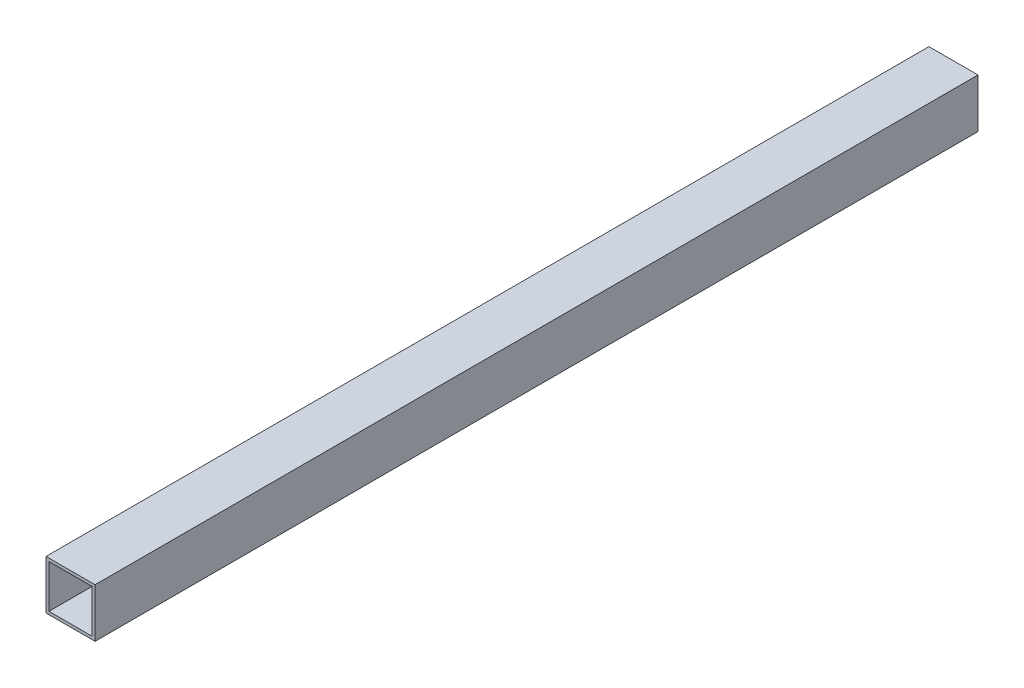
ISO-10303-21;
HEADER;
FILE_DESCRIPTION(('STEP AP214'),'2;1');
FILE_NAME('part.step','',(''),(''),'','','');
FILE_SCHEMA(('AUTOMOTIVE_DESIGN { 1 0 10303 214 1 1 1 1 }'));
ENDSEC;
DATA;
#1=APPLICATION_CONTEXT('core data for automotive mechanical design processes');
#2=APPLICATION_PROTOCOL_DEFINITION('international standard','automotive_design',2000,#1);
#3=PRODUCT_CONTEXT('',#1,'mechanical');
#4=PRODUCT('Part','Part','',(#3));
#5=PRODUCT_RELATED_PRODUCT_CATEGORY('part','',(#4));
#6=PRODUCT_DEFINITION_FORMATION('','',#4);
#7=PRODUCT_DEFINITION_CONTEXT('part definition',#1,'design');
#8=PRODUCT_DEFINITION('design','',#6,#7);
#9=PRODUCT_DEFINITION_SHAPE('','',#8);
#10=(LENGTH_UNIT() NAMED_UNIT(*) SI_UNIT(.MILLI.,.METRE.));
#11=(NAMED_UNIT(*) PLANE_ANGLE_UNIT() SI_UNIT($,.RADIAN.));
#12=(NAMED_UNIT(*) SI_UNIT($,.STERADIAN.) SOLID_ANGLE_UNIT());
#13=UNCERTAINTY_MEASURE_WITH_UNIT(LENGTH_MEASURE(1.E-05),#10,'distance_accuracy_value','');
#14=(GEOMETRIC_REPRESENTATION_CONTEXT(3) GLOBAL_UNCERTAINTY_ASSIGNED_CONTEXT((#13)) GLOBAL_UNIT_ASSIGNED_CONTEXT((#10,
#11,#12)) REPRESENTATION_CONTEXT('',''));
#15=CARTESIAN_POINT('',(0.,0.,0.));
#16=DIRECTION('',(0.,0.,1.));
#17=DIRECTION('',(1.,0.,0.));
#18=AXIS2_PLACEMENT_3D('',#15,#16,#17);
#19=CARTESIAN_POINT('',(0.,0.,450.));
#20=DIRECTION('',(0.,0.,-1.));
#21=DIRECTION('',(-1.,0.,0.));
#22=AXIS2_PLACEMENT_3D('',#19,#20,#21);
#23=PLANE('',#22);
#24=DIRECTION('',(0.,1.,0.));
#25=VECTOR('',#24,1.);
#26=CARTESIAN_POINT('',(25.,-25.,450.));
#27=LINE('',#26,#25);
#28=CARTESIAN_POINT('',(25.,-25.,450.));
#29=VERTEX_POINT('',#28);
#30=CARTESIAN_POINT('',(25.,25.,450.));
#31=VERTEX_POINT('',#30);
#32=EDGE_CURVE('E153',#29,#31,#27,.T.);
#33=ORIENTED_EDGE('',*,*,#32,.T.);
#34=DIRECTION('',(-1.,0.,0.));
#35=VECTOR('',#34,1.);
#36=CARTESIAN_POINT('',(-25.,25.,450.));
#37=LINE('',#36,#35);
#38=CARTESIAN_POINT('',(-25.,25.,450.));
#39=VERTEX_POINT('',#38);
#40=EDGE_CURVE('E157',#31,#39,#37,.T.);
#41=ORIENTED_EDGE('',*,*,#40,.T.);
#42=DIRECTION('',(0.,-1.,0.));
#43=VECTOR('',#42,1.);
#44=CARTESIAN_POINT('',(-25.,-25.,450.));
#45=LINE('',#44,#43);
#46=CARTESIAN_POINT('',(-25.,-25.,450.));
#47=VERTEX_POINT('',#46);
#48=EDGE_CURVE('E161',#39,#47,#45,.T.);
#49=ORIENTED_EDGE('',*,*,#48,.T.);
#50=DIRECTION('',(1.,0.,0.));
#51=VECTOR('',#50,1.);
#52=CARTESIAN_POINT('',(-25.,-25.,450.));
#53=LINE('',#52,#51);
#54=EDGE_CURVE('E164',#47,#29,#53,.T.);
#55=ORIENTED_EDGE('',*,*,#54,.T.);
#56=EDGE_LOOP('',(#33,#41,#49,#55));
#57=FACE_BOUND('',#56,.T.);
#58=DIRECTION('',(1.,0.,0.));
#59=VECTOR('',#58,1.);
#60=CARTESIAN_POINT('',(-22.,-22.,450.));
#61=LINE('',#60,#59);
#62=CARTESIAN_POINT('',(-22.,-22.,450.));
#63=VERTEX_POINT('',#62);
#64=CARTESIAN_POINT('',(22.,-22.,450.));
#65=VERTEX_POINT('',#64);
#66=EDGE_CURVE('E105',#63,#65,#61,.T.);
#67=ORIENTED_EDGE('',*,*,#66,.F.);
#68=DIRECTION('',(0.,-1.,0.));
#69=VECTOR('',#68,1.);
#70=CARTESIAN_POINT('',(-22.,-22.,450.));
#71=LINE('',#70,#69);
#72=CARTESIAN_POINT('',(-22.,22.,450.));
#73=VERTEX_POINT('',#72);
#74=EDGE_CURVE('E131',#73,#63,#71,.T.);
#75=ORIENTED_EDGE('',*,*,#74,.F.);
#76=DIRECTION('',(-1.,0.,0.));
#77=VECTOR('',#76,1.);
#78=CARTESIAN_POINT('',(-22.,22.,450.));
#79=LINE('',#78,#77);
#80=CARTESIAN_POINT('',(22.,22.,450.));
#81=VERTEX_POINT('',#80);
#82=EDGE_CURVE('E127',#81,#73,#79,.T.);
#83=ORIENTED_EDGE('',*,*,#82,.F.);
#84=DIRECTION('',(0.,1.,0.));
#85=VECTOR('',#84,1.);
#86=CARTESIAN_POINT('',(22.,-22.,450.));
#87=LINE('',#86,#85);
#88=EDGE_CURVE('E114',#65,#81,#87,.T.);
#89=ORIENTED_EDGE('',*,*,#88,.F.);
#90=EDGE_LOOP('',(#67,#75,#83,#89));
#91=FACE_BOUND('',#90,.T.);
#92=ADVANCED_FACE('F39',(#57,#91),#23,.F.);
#93=CARTESIAN_POINT('',(0.,0.,-450.));
#94=DIRECTION('',(0.,0.,-1.));
#95=DIRECTION('',(-1.,0.,0.));
#96=AXIS2_PLACEMENT_3D('',#93,#94,#95);
#97=PLANE('',#96);
#98=DIRECTION('',(0.,1.,0.));
#99=VECTOR('',#98,1.);
#100=CARTESIAN_POINT('',(25.,-25.,-450.));
#101=LINE('',#100,#99);
#102=CARTESIAN_POINT('',(25.,-25.,-450.));
#103=VERTEX_POINT('',#102);
#104=CARTESIAN_POINT('',(25.,25.,-450.));
#105=VERTEX_POINT('',#104);
#106=EDGE_CURVE('E123',#103,#105,#101,.T.);
#107=ORIENTED_EDGE('',*,*,#106,.F.);
#108=DIRECTION('',(1.,0.,0.));
#109=VECTOR('',#108,1.);
#110=CARTESIAN_POINT('',(-25.,-25.,-450.));
#111=LINE('',#110,#109);
#112=CARTESIAN_POINT('',(-25.,-25.,-450.));
#113=VERTEX_POINT('',#112);
#114=EDGE_CURVE('E158',#113,#103,#111,.T.);
#115=ORIENTED_EDGE('',*,*,#114,.F.);
#116=DIRECTION('',(0.,-1.,0.));
#117=VECTOR('',#116,1.);
#118=CARTESIAN_POINT('',(-25.,-25.,-450.));
#119=LINE('',#118,#117);
#120=CARTESIAN_POINT('',(-25.,25.,-450.));
#121=VERTEX_POINT('',#120);
#122=EDGE_CURVE('E174',#121,#113,#119,.T.);
#123=ORIENTED_EDGE('',*,*,#122,.F.);
#124=DIRECTION('',(-1.,0.,0.));
#125=VECTOR('',#124,1.);
#126=CARTESIAN_POINT('',(-25.,25.,-450.));
#127=LINE('',#126,#125);
#128=EDGE_CURVE('E171',#105,#121,#127,.T.);
#129=ORIENTED_EDGE('',*,*,#128,.F.);
#130=EDGE_LOOP('',(#107,#115,#123,#129));
#131=FACE_BOUND('',#130,.T.);
#132=DIRECTION('',(0.,-1.,0.));
#133=VECTOR('',#132,1.);
#134=CARTESIAN_POINT('',(-22.,-22.,-450.));
#135=LINE('',#134,#133);
#136=CARTESIAN_POINT('',(-22.,22.,-450.));
#137=VERTEX_POINT('',#136);
#138=CARTESIAN_POINT('',(-22.,-22.,-450.));
#139=VERTEX_POINT('',#138);
#140=EDGE_CURVE('E115',#137,#139,#135,.T.);
#141=ORIENTED_EDGE('',*,*,#140,.T.);
#142=DIRECTION('',(1.,0.,0.));
#143=VECTOR('',#142,1.);
#144=CARTESIAN_POINT('',(-22.,-22.,-450.));
#145=LINE('',#144,#143);
#146=CARTESIAN_POINT('',(22.,-22.,-450.));
#147=VERTEX_POINT('',#146);
#148=EDGE_CURVE('E63',#139,#147,#145,.T.);
#149=ORIENTED_EDGE('',*,*,#148,.T.);
#150=DIRECTION('',(0.,1.,0.));
#151=VECTOR('',#150,1.);
#152=CARTESIAN_POINT('',(22.,-22.,-450.));
#153=LINE('',#152,#151);
#154=CARTESIAN_POINT('',(22.,22.,-450.));
#155=VERTEX_POINT('',#154);
#156=EDGE_CURVE('E121',#147,#155,#153,.T.);
#157=ORIENTED_EDGE('',*,*,#156,.T.);
#158=DIRECTION('',(-1.,0.,0.));
#159=VECTOR('',#158,1.);
#160=CARTESIAN_POINT('',(-22.,22.,-450.));
#161=LINE('',#160,#159);
#162=EDGE_CURVE('E140',#155,#137,#161,.T.);
#163=ORIENTED_EDGE('',*,*,#162,.T.);
#164=EDGE_LOOP('',(#141,#149,#157,#163));
#165=FACE_BOUND('',#164,.T.);
#166=ADVANCED_FACE('F197',(#131,#165),#97,.T.);
#167=CARTESIAN_POINT('',(25.,-25.,450.));
#168=DIRECTION('',(-1.,0.,0.));
#169=DIRECTION('',(0.,0.,1.));
#170=AXIS2_PLACEMENT_3D('',#167,#168,#169);
#171=PLANE('',#170);
#172=ORIENTED_EDGE('',*,*,#106,.T.);
#173=DIRECTION('',(0.,0.,-1.));
#174=VECTOR('',#173,1.);
#175=CARTESIAN_POINT('',(25.,25.,450.));
#176=LINE('',#175,#174);
#177=EDGE_CURVE('E11',#31,#105,#176,.T.);
#178=ORIENTED_EDGE('',*,*,#177,.F.);
#179=ORIENTED_EDGE('',*,*,#32,.F.);
#180=DIRECTION('',(0.,0.,-1.));
#181=VECTOR('',#180,1.);
#182=CARTESIAN_POINT('',(25.,-25.,450.));
#183=LINE('',#182,#181);
#184=EDGE_CURVE('E167',#29,#103,#183,.T.);
#185=ORIENTED_EDGE('',*,*,#184,.T.);
#186=EDGE_LOOP('',(#172,#178,#179,#185));
#187=FACE_BOUND('',#186,.T.);
#188=ADVANCED_FACE('F41',(#187),#171,.F.);
#189=CARTESIAN_POINT('',(-25.,25.,450.));
#190=DIRECTION('',(0.,-1.,0.));
#191=DIRECTION('',(0.,0.,-1.));
#192=AXIS2_PLACEMENT_3D('',#189,#190,#191);
#193=PLANE('',#192);
#194=ORIENTED_EDGE('',*,*,#128,.T.);
#195=DIRECTION('',(0.,0.,-1.));
#196=VECTOR('',#195,1.);
#197=CARTESIAN_POINT('',(-25.,25.,450.));
#198=LINE('',#197,#196);
#199=EDGE_CURVE('E48',#39,#121,#198,.T.);
#200=ORIENTED_EDGE('',*,*,#199,.F.);
#201=ORIENTED_EDGE('',*,*,#40,.F.);
#202=ORIENTED_EDGE('',*,*,#177,.T.);
#203=EDGE_LOOP('',(#194,#200,#201,#202));
#204=FACE_BOUND('',#203,.T.);
#205=ADVANCED_FACE('F207',(#204),#193,.F.);
#206=CARTESIAN_POINT('',(-25.,-25.,450.));
#207=DIRECTION('',(1.,0.,0.));
#208=DIRECTION('',(0.,0.,-1.));
#209=AXIS2_PLACEMENT_3D('',#206,#207,#208);
#210=PLANE('',#209);
#211=ORIENTED_EDGE('',*,*,#122,.T.);
#212=DIRECTION('',(0.,0.,-1.));
#213=VECTOR('',#212,1.);
#214=CARTESIAN_POINT('',(-25.,-25.,450.));
#215=LINE('',#214,#213);
#216=EDGE_CURVE('E182',#47,#113,#215,.T.);
#217=ORIENTED_EDGE('',*,*,#216,.F.);
#218=ORIENTED_EDGE('',*,*,#48,.F.);
#219=ORIENTED_EDGE('',*,*,#199,.T.);
#220=EDGE_LOOP('',(#211,#217,#218,#219));
#221=FACE_BOUND('',#220,.T.);
#222=ADVANCED_FACE('F191',(#221),#210,.F.);
#223=CARTESIAN_POINT('',(-25.,-25.,450.));
#224=DIRECTION('',(0.,1.,0.));
#225=DIRECTION('',(0.,0.,1.));
#226=AXIS2_PLACEMENT_3D('',#223,#224,#225);
#227=PLANE('',#226);
#228=ORIENTED_EDGE('',*,*,#114,.T.);
#229=ORIENTED_EDGE('',*,*,#184,.F.);
#230=ORIENTED_EDGE('',*,*,#54,.F.);
#231=ORIENTED_EDGE('',*,*,#216,.T.);
#232=EDGE_LOOP('',(#228,#229,#230,#231));
#233=FACE_BOUND('',#232,.T.);
#234=ADVANCED_FACE('F201',(#233),#227,.F.);
#235=CARTESIAN_POINT('',(-22.,-22.,450.));
#236=DIRECTION('',(0.,1.,0.));
#237=DIRECTION('',(0.,0.,1.));
#238=AXIS2_PLACEMENT_3D('',#235,#236,#237);
#239=PLANE('',#238);
#240=ORIENTED_EDGE('',*,*,#148,.F.);
#241=DIRECTION('',(0.,0.,-1.));
#242=VECTOR('',#241,1.);
#243=CARTESIAN_POINT('',(-22.,-22.,450.));
#244=LINE('',#243,#242);
#245=EDGE_CURVE('E109',#63,#139,#244,.T.);
#246=ORIENTED_EDGE('',*,*,#245,.F.);
#247=ORIENTED_EDGE('',*,*,#66,.T.);
#248=DIRECTION('',(0.,0.,-1.));
#249=VECTOR('',#248,1.);
#250=CARTESIAN_POINT('',(22.,-22.,450.));
#251=LINE('',#250,#249);
#252=EDGE_CURVE('E108',#65,#147,#251,.T.);
#253=ORIENTED_EDGE('',*,*,#252,.T.);
#254=EDGE_LOOP('',(#240,#246,#247,#253));
#255=FACE_BOUND('',#254,.T.);
#256=ADVANCED_FACE('F107',(#255),#239,.T.);
#257=CARTESIAN_POINT('',(22.,-22.,450.));
#258=DIRECTION('',(-1.,0.,0.));
#259=DIRECTION('',(0.,0.,1.));
#260=AXIS2_PLACEMENT_3D('',#257,#258,#259);
#261=PLANE('',#260);
#262=ORIENTED_EDGE('',*,*,#156,.F.);
#263=ORIENTED_EDGE('',*,*,#252,.F.);
#264=ORIENTED_EDGE('',*,*,#88,.T.);
#265=DIRECTION('',(0.,0.,-1.));
#266=VECTOR('',#265,1.);
#267=CARTESIAN_POINT('',(22.,22.,450.));
#268=LINE('',#267,#266);
#269=EDGE_CURVE('E124',#81,#155,#268,.T.);
#270=ORIENTED_EDGE('',*,*,#269,.T.);
#271=EDGE_LOOP('',(#262,#263,#264,#270));
#272=FACE_BOUND('',#271,.T.);
#273=ADVANCED_FACE('F118',(#272),#261,.T.);
#274=CARTESIAN_POINT('',(-22.,22.,450.));
#275=DIRECTION('',(0.,-1.,0.));
#276=DIRECTION('',(1.,0.,0.));
#277=AXIS2_PLACEMENT_3D('',#274,#275,#276);
#278=PLANE('',#277);
#279=ORIENTED_EDGE('',*,*,#162,.F.);
#280=ORIENTED_EDGE('',*,*,#269,.F.);
#281=ORIENTED_EDGE('',*,*,#82,.T.);
#282=DIRECTION('',(0.,0.,-1.));
#283=VECTOR('',#282,1.);
#284=CARTESIAN_POINT('',(-22.,22.,450.));
#285=LINE('',#284,#283);
#286=EDGE_CURVE('E55',#73,#137,#285,.T.);
#287=ORIENTED_EDGE('',*,*,#286,.T.);
#288=EDGE_LOOP('',(#279,#280,#281,#287));
#289=FACE_BOUND('',#288,.T.);
#290=ADVANCED_FACE('F230',(#289),#278,.T.);
#291=CARTESIAN_POINT('',(-22.,-22.,450.));
#292=DIRECTION('',(1.,0.,0.));
#293=DIRECTION('',(0.,0.,-1.));
#294=AXIS2_PLACEMENT_3D('',#291,#292,#293);
#295=PLANE('',#294);
#296=ORIENTED_EDGE('',*,*,#140,.F.);
#297=ORIENTED_EDGE('',*,*,#286,.F.);
#298=ORIENTED_EDGE('',*,*,#74,.T.);
#299=ORIENTED_EDGE('',*,*,#245,.T.);
#300=EDGE_LOOP('',(#296,#297,#298,#299));
#301=FACE_BOUND('',#300,.T.);
#302=ADVANCED_FACE('F234',(#301),#295,.T.);
#303=CLOSED_SHELL('',(#92,#166,#188,#205,#222,#234,#256,#273,#290,#302));
#304=MANIFOLD_SOLID_BREP('B2',#303);
#305=ADVANCED_BREP_SHAPE_REPRESENTATION('',(#18,#304),#14);
#306=SHAPE_DEFINITION_REPRESENTATION(#9,#305);
ENDSEC;
END-ISO-10303-21;
